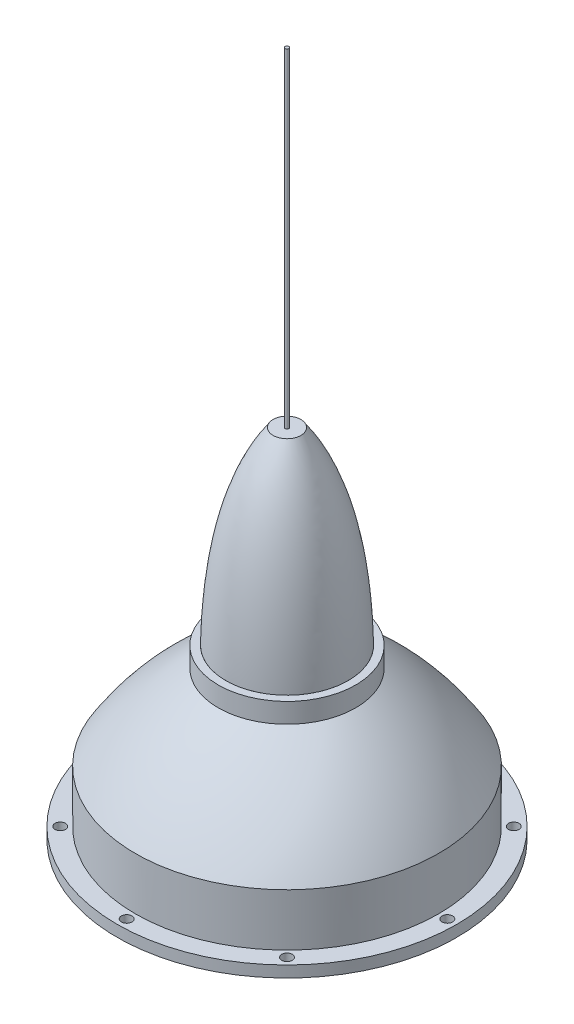
ISO-10303-21;
HEADER;
FILE_DESCRIPTION(('STEP AP214'),'2;1');
FILE_NAME('part.step','',(''),(''),'','','');
FILE_SCHEMA(('AUTOMOTIVE_DESIGN { 1 0 10303 214 1 1 1 1 }'));
ENDSEC;
DATA;
#1=APPLICATION_CONTEXT('core data for automotive mechanical design processes');
#2=APPLICATION_PROTOCOL_DEFINITION('international standard','automotive_design',2000,#1);
#3=PRODUCT_CONTEXT('',#1,'mechanical');
#4=PRODUCT('Part','Part','',(#3));
#5=PRODUCT_RELATED_PRODUCT_CATEGORY('part','',(#4));
#6=PRODUCT_DEFINITION_FORMATION('','',#4);
#7=PRODUCT_DEFINITION_CONTEXT('part definition',#1,'design');
#8=PRODUCT_DEFINITION('design','',#6,#7);
#9=PRODUCT_DEFINITION_SHAPE('','',#8);
#10=(LENGTH_UNIT() NAMED_UNIT(*) SI_UNIT(.MILLI.,.METRE.));
#11=(NAMED_UNIT(*) PLANE_ANGLE_UNIT() SI_UNIT($,.RADIAN.));
#12=(NAMED_UNIT(*) SI_UNIT($,.STERADIAN.) SOLID_ANGLE_UNIT());
#13=UNCERTAINTY_MEASURE_WITH_UNIT(LENGTH_MEASURE(1.E-05),#10,'distance_accuracy_value','');
#14=(GEOMETRIC_REPRESENTATION_CONTEXT(3) GLOBAL_UNCERTAINTY_ASSIGNED_CONTEXT((#13)) GLOBAL_UNIT_ASSIGNED_CONTEXT((#10,
#11,#12)) REPRESENTATION_CONTEXT('',''));
#15=CARTESIAN_POINT('',(0.,0.,0.));
#16=DIRECTION('',(0.,0.,1.));
#17=DIRECTION('',(1.,0.,0.));
#18=AXIS2_PLACEMENT_3D('',#15,#16,#17);
#19=CARTESIAN_POINT('',(3.67004780163327,86.5571134055351,0.));
#20=CARTESIAN_POINT('',(15.6355390227846,69.8890645806119,0.));
#21=CARTESIAN_POINT('',(16.2195562711198,36.557113405535,0.));
#22=B_SPLINE_CURVE_WITH_KNOTS('',2,(#19,#20,#21),.UNSPECIFIED.,.F.,.F.,(3,3),(0.,1.),.UNSPECIFIED.);
#23=CARTESIAN_POINT('',(0.,36.5571134055351,0.));
#24=DIRECTION('',(0.,-1.,0.));
#25=AXIS1_PLACEMENT('',#23,#24);
#26=SURFACE_OF_REVOLUTION('',#22,#25);
#27=CARTESIAN_POINT('',(0.,36.5571134055351,0.));
#28=DIRECTION('',(0.,-1.,0.));
#29=DIRECTION('',(0.,0.,-1.));
#30=AXIS2_PLACEMENT_3D('',#27,#28,#29);
#31=CIRCLE('',#30,16.2195562711198);
#32=CARTESIAN_POINT('',(0.,36.5571134055351,-16.2195562711198));
#33=VERTEX_POINT('',#32);
#34=EDGE_CURVE('E56',#33,#33,#31,.T.);
#35=ORIENTED_EDGE('',*,*,#34,.F.);
#36=EDGE_LOOP('',(#35));
#37=FACE_BOUND('',#36,.T.);
#38=CARTESIAN_POINT('',(0.,86.5571134055351,0.));
#39=DIRECTION('',(0.,-1.,0.));
#40=DIRECTION('',(0.,0.,-1.));
#41=AXIS2_PLACEMENT_3D('',#38,#39,#40);
#42=CIRCLE('',#41,3.67004780163327);
#43=CARTESIAN_POINT('',(0.,86.5571134055351,-3.67004780163327));
#44=VERTEX_POINT('',#43);
#45=EDGE_CURVE('E52',#44,#44,#42,.T.);
#46=ORIENTED_EDGE('',*,*,#45,.T.);
#47=EDGE_LOOP('',(#46));
#48=FACE_BOUND('',#47,.T.);
#49=ADVANCED_FACE('F45',(#37,#48),#26,.T.);
#50=CARTESIAN_POINT('',(0.,86.5571134055351,0.));
#51=DIRECTION('',(0.,-1.,0.));
#52=DIRECTION('',(0.,0.,-1.));
#53=AXIS2_PLACEMENT_3D('',#50,#51,#52);
#54=PLANE('',#53);
#55=CARTESIAN_POINT('',(0.,86.5571134055351,0.));
#56=DIRECTION('',(0.,-1.,0.));
#57=DIRECTION('',(0.,0.,-1.));
#58=AXIS2_PLACEMENT_3D('',#55,#56,#57);
#59=CIRCLE('',#58,0.5);
#60=CARTESIAN_POINT('',(0.,86.5571134055351,-0.5));
#61=VERTEX_POINT('',#60);
#62=EDGE_CURVE('E11',#61,#61,#59,.F.);
#63=ORIENTED_EDGE('',*,*,#62,.F.);
#64=EDGE_LOOP('',(#63));
#65=FACE_BOUND('',#64,.T.);
#66=ORIENTED_EDGE('',*,*,#45,.F.);
#67=EDGE_LOOP('',(#66));
#68=FACE_BOUND('',#67,.T.);
#69=ADVANCED_FACE('F83',(#65,#68),#54,.F.);
#70=CARTESIAN_POINT('',(0.,36.5571134055351,0.));
#71=DIRECTION('',(0.,1.,0.));
#72=DIRECTION('',(0.,0.,1.));
#73=AXIS2_PLACEMENT_3D('',#70,#71,#72);
#74=PLANE('',#73);
#75=ORIENTED_EDGE('',*,*,#34,.T.);
#76=EDGE_LOOP('',(#75));
#77=FACE_BOUND('',#76,.T.);
#78=ADVANCED_FACE('F76',(#77),#74,.F.);
#79=CARTESIAN_POINT('',(0.,173.757113405535,0.));
#80=DIRECTION('',(0.,-1.,0.));
#81=DIRECTION('',(0.,0.,-1.));
#82=AXIS2_PLACEMENT_3D('',#79,#80,#81);
#83=CYLINDRICAL_SURFACE('',#82,0.5);
#84=CARTESIAN_POINT('',(0.,173.757113405535,0.));
#85=DIRECTION('',(0.,1.,0.));
#86=DIRECTION('',(0.,0.,1.));
#87=AXIS2_PLACEMENT_3D('',#84,#85,#86);
#88=CIRCLE('',#87,0.5);
#89=CARTESIAN_POINT('',(0.,173.757113405535,0.5));
#90=VERTEX_POINT('',#89);
#91=EDGE_CURVE('E60',#90,#90,#88,.T.);
#92=ORIENTED_EDGE('',*,*,#91,.F.);
#93=EDGE_LOOP('',(#92));
#94=FACE_BOUND('',#93,.T.);
#95=ORIENTED_EDGE('',*,*,#62,.T.);
#96=EDGE_LOOP('',(#95));
#97=FACE_BOUND('',#96,.T.);
#98=ADVANCED_FACE('F74',(#94,#97),#83,.T.);
#99=CARTESIAN_POINT('',(0.,173.757113405535,0.));
#100=DIRECTION('',(0.,1.,0.));
#101=DIRECTION('',(0.,0.,1.));
#102=AXIS2_PLACEMENT_3D('',#99,#100,#101);
#103=PLANE('',#102);
#104=ORIENTED_EDGE('',*,*,#91,.T.);
#105=EDGE_LOOP('',(#104));
#106=FACE_BOUND('',#105,.T.);
#107=ADVANCED_FACE('F72',(#106),#103,.T.);
#108=CLOSED_SHELL('',(#49,#69,#78,#98,#107));
#109=MANIFOLD_SOLID_BREP('B2',#108);
#110=CARTESIAN_POINT('',(0.,10.,0.));
#111=DIRECTION('',(0.,-1.,0.));
#112=DIRECTION('',(0.,0.,-1.));
#113=AXIS2_PLACEMENT_3D('',#110,#111,#112);
#114=CYLINDRICAL_SURFACE('',#113,45.);
#115=CARTESIAN_POINT('',(0.,-8.,0.));
#116=DIRECTION('',(0.,-1.,0.));
#117=DIRECTION('',(0.,0.,-1.));
#118=AXIS2_PLACEMENT_3D('',#115,#116,#117);
#119=CIRCLE('',#118,45.);
#120=CARTESIAN_POINT('',(0.,-8.,-45.));
#121=VERTEX_POINT('',#120);
#122=EDGE_CURVE('E204',#121,#121,#119,.T.);
#123=ORIENTED_EDGE('',*,*,#122,.F.);
#124=EDGE_LOOP('',(#123));
#125=FACE_BOUND('',#124,.T.);
#126=CARTESIAN_POINT('',(0.,-4.99999999999999,0.));
#127=DIRECTION('',(0.,1.,0.));
#128=DIRECTION('',(0.,0.,1.));
#129=AXIS2_PLACEMENT_3D('',#126,#127,#128);
#130=CIRCLE('',#129,45.);
#131=CARTESIAN_POINT('',(0.,-4.99999999999999,45.));
#132=VERTEX_POINT('',#131);
#133=EDGE_CURVE('E198',#132,#132,#130,.T.);
#134=ORIENTED_EDGE('',*,*,#133,.F.);
#135=EDGE_LOOP('',(#134));
#136=FACE_BOUND('',#135,.T.);
#137=ADVANCED_FACE('F136',(#125,#136),#114,.T.);
#138=CARTESIAN_POINT('',(0.,6.,0.));
#139=DIRECTION('',(0.,-1.,0.));
#140=DIRECTION('',(0.,0.,-1.));
#141=AXIS2_PLACEMENT_3D('',#138,#139,#140);
#142=CYLINDRICAL_SURFACE('',#141,37.3593996728975);
#143=CARTESIAN_POINT('',(0.,-8.,0.));
#144=DIRECTION('',(0.,-1.,0.));
#145=DIRECTION('',(0.,0.,-1.));
#146=AXIS2_PLACEMENT_3D('',#143,#144,#145);
#147=CIRCLE('',#146,37.3593996728975);
#148=CARTESIAN_POINT('',(0.,-8.,-37.3593996728975));
#149=VERTEX_POINT('',#148);
#150=EDGE_CURVE('E201',#149,#149,#147,.T.);
#151=ORIENTED_EDGE('',*,*,#150,.T.);
#152=EDGE_LOOP('',(#151));
#153=FACE_BOUND('',#152,.T.);
#154=CARTESIAN_POINT('',(0.,6.,0.));
#155=DIRECTION('',(0.,-1.,0.));
#156=DIRECTION('',(0.,0.,-1.));
#157=AXIS2_PLACEMENT_3D('',#154,#155,#156);
#158=CIRCLE('',#157,37.3593996728975);
#159=CARTESIAN_POINT('',(0.,6.,-37.3593996728975));
#160=VERTEX_POINT('',#159);
#161=EDGE_CURVE('E213',#160,#160,#158,.T.);
#162=ORIENTED_EDGE('',*,*,#161,.F.);
#163=EDGE_LOOP('',(#162));
#164=FACE_BOUND('',#163,.T.);
#165=ADVANCED_FACE('F236',(#153,#164),#142,.F.);
#166=CARTESIAN_POINT('',(45.,0.,0.));
#167=CARTESIAN_POINT('',(38.3606255797979,14.1228774563605,0.));
#168=CARTESIAN_POINT('',(28.7671443364168,24.9752485917934,0.));
#169=CARTESIAN_POINT('',(16.2195562711198,32.5571134055351,0.));
#170=B_SPLINE_CURVE_WITH_KNOTS('',3,(#166,#167,#168,#169),.UNSPECIFIED.,.F.,.F.,(4,4),
(0.282784636754398,1.),.UNSPECIFIED.);
#171=CARTESIAN_POINT('',(0.,0.,0.));
#172=DIRECTION('',(0.,-1.,0.));
#173=AXIS1_PLACEMENT('',#171,#172);
#174=SURFACE_OF_REVOLUTION('',#170,#173);
#175=CARTESIAN_POINT('',(0.,31.304696185932,0.));
#176=DIRECTION('',(0.,-1.,0.));
#177=DIRECTION('',(0.,0.,-1.));
#178=AXIS2_PLACEMENT_3D('',#175,#176,#177);
#179=CIRCLE('',#178,18.2195562711198);
#180=CARTESIAN_POINT('',(0.,31.304696185932,-18.2195562711198));
#181=VERTEX_POINT('',#180);
#182=EDGE_CURVE('E44',#181,#181,#179,.F.);
#183=ORIENTED_EDGE('',*,*,#182,.F.);
#184=EDGE_LOOP('',(#183));
#185=FACE_BOUND('',#184,.T.);
#186=CARTESIAN_POINT('',(0.,8.85457499686986,0.));
#187=DIRECTION('',(0.,-1.,0.));
#188=DIRECTION('',(0.,0.,-1.));
#189=AXIS2_PLACEMENT_3D('',#186,#187,#188);
#190=CIRCLE('',#189,40.183847224859);
#191=CARTESIAN_POINT('',(0.,8.85457499686986,-40.183847224859));
#192=VERTEX_POINT('',#191);
#193=EDGE_CURVE('E154',#192,#192,#190,.F.);
#194=ORIENTED_EDGE('',*,*,#193,.T.);
#195=EDGE_LOOP('',(#194));
#196=FACE_BOUND('',#195,.T.);
#197=ADVANCED_FACE('F138',(#185,#196),#174,.F.);
#198=CARTESIAN_POINT('',(40.4481260719283,0.,0.));
#199=CARTESIAN_POINT('',(34.9985446803902,12.0780798448771,0.));
#200=CARTESIAN_POINT('',(26.9223547467816,21.8268668205378,0.));
#201=CARTESIAN_POINT('',(16.2195562711198,29.2463609269701,0.));
#202=B_SPLINE_CURVE_WITH_KNOTS('',3,(#198,#199,#200,#201),.UNSPECIFIED.,.F.,.F.,(4,4),(0.,
0.864735690541335),.UNSPECIFIED.);
#203=CARTESIAN_POINT('',(0.,0.,0.));
#204=DIRECTION('',(0.,-1.,0.));
#205=AXIS1_PLACEMENT('',#203,#204);
#206=SURFACE_OF_REVOLUTION('',#202,#205);
#207=CARTESIAN_POINT('',(0.,29.2463609269701,0.));
#208=DIRECTION('',(0.,-1.,0.));
#209=DIRECTION('',(0.,0.,-1.));
#210=AXIS2_PLACEMENT_3D('',#207,#208,#209);
#211=CIRCLE('',#210,16.2195562711198);
#212=CARTESIAN_POINT('',(0.,29.2463609269701,-16.2195562711198));
#213=VERTEX_POINT('',#212);
#214=EDGE_CURVE('E150',#213,#213,#211,.T.);
#215=ORIENTED_EDGE('',*,*,#214,.F.);
#216=EDGE_LOOP('',(#215));
#217=FACE_BOUND('',#216,.T.);
#218=CARTESIAN_POINT('',(0.,6.,0.));
#219=DIRECTION('',(0.,-1.,0.));
#220=DIRECTION('',(0.,0.,-1.));
#221=AXIS2_PLACEMENT_3D('',#218,#219,#220);
#222=CIRCLE('',#221,37.4174184704641);
#223=CARTESIAN_POINT('',(0.,6.,-37.4174184704641));
#224=VERTEX_POINT('',#223);
#225=EDGE_CURVE('E145',#224,#224,#222,.F.);
#226=ORIENTED_EDGE('',*,*,#225,.F.);
#227=EDGE_LOOP('',(#226));
#228=FACE_BOUND('',#227,.T.);
#229=ADVANCED_FACE('F223',(#217,#228),#206,.T.);
#230=CARTESIAN_POINT('',(0.,0.,0.));
#231=DIRECTION('',(0.,-1.,0.));
#232=DIRECTION('',(0.,0.,-1.));
#233=AXIS2_PLACEMENT_3D('',#230,#231,#232);
#234=CYLINDRICAL_SURFACE('',#233,16.2195562711198);
#235=ORIENTED_EDGE('',*,*,#214,.T.);
#236=EDGE_LOOP('',(#235));
#237=FACE_BOUND('',#236,.T.);
#238=CARTESIAN_POINT('',(0.,36.5571134055351,0.));
#239=DIRECTION('',(0.,1.,0.));
#240=DIRECTION('',(0.,0.,1.));
#241=AXIS2_PLACEMENT_3D('',#238,#239,#240);
#242=CIRCLE('',#241,16.2195562711198);
#243=CARTESIAN_POINT('',(0.,36.5571134055351,16.2195562711198));
#244=VERTEX_POINT('',#243);
#245=EDGE_CURVE('E207',#244,#244,#242,.T.);
#246=ORIENTED_EDGE('',*,*,#245,.T.);
#247=EDGE_LOOP('',(#246));
#248=FACE_BOUND('',#247,.T.);
#249=ADVANCED_FACE('F226',(#237,#248),#234,.F.);
#250=CARTESIAN_POINT('',(0.,6.,0.));
#251=DIRECTION('',(0.,-1.,0.));
#252=DIRECTION('',(0.,0.,-1.));
#253=AXIS2_PLACEMENT_3D('',#250,#251,#252);
#254=PLANE('',#253);
#255=ORIENTED_EDGE('',*,*,#161,.T.);
#256=EDGE_LOOP('',(#255));
#257=FACE_BOUND('',#256,.T.);
#258=ORIENTED_EDGE('',*,*,#225,.T.);
#259=EDGE_LOOP('',(#258));
#260=FACE_BOUND('',#259,.T.);
#261=ADVANCED_FACE('F230',(#257,#260),#254,.F.);
#262=CARTESIAN_POINT('',(0.,11.,0.));
#263=DIRECTION('',(0.,-1.,0.));
#264=DIRECTION('',(0.,0.,-1.));
#265=AXIS2_PLACEMENT_3D('',#262,#263,#264);
#266=CYLINDRICAL_SURFACE('',#265,40.183847224859);
#267=ORIENTED_EDGE('',*,*,#193,.F.);
#268=EDGE_LOOP('',(#267));
#269=FACE_BOUND('',#268,.T.);
#270=CARTESIAN_POINT('',(0.,-4.99999999999999,0.));
#271=DIRECTION('',(0.,1.,0.));
#272=DIRECTION('',(0.,0.,1.));
#273=AXIS2_PLACEMENT_3D('',#270,#271,#272);
#274=CIRCLE('',#273,40.183847224859);
#275=CARTESIAN_POINT('',(0.,-4.99999999999999,40.183847224859));
#276=VERTEX_POINT('',#275);
#277=EDGE_CURVE('E195',#276,#276,#274,.T.);
#278=ORIENTED_EDGE('',*,*,#277,.T.);
#279=EDGE_LOOP('',(#278));
#280=FACE_BOUND('',#279,.T.);
#281=ADVANCED_FACE('F234',(#269,#280),#266,.T.);
#282=CARTESIAN_POINT('',(0.,29.5571134055351,0.));
#283=DIRECTION('',(0.,1.,0.));
#284=DIRECTION('',(0.,0.,1.));
#285=AXIS2_PLACEMENT_3D('',#282,#283,#284);
#286=CYLINDRICAL_SURFACE('',#285,18.2195562711198);
#287=ORIENTED_EDGE('',*,*,#182,.T.);
#288=EDGE_LOOP('',(#287));
#289=FACE_BOUND('',#288,.T.);
#290=CARTESIAN_POINT('',(0.,36.5571134055351,0.));
#291=DIRECTION('',(0.,1.,0.));
#292=DIRECTION('',(0.,0.,1.));
#293=AXIS2_PLACEMENT_3D('',#290,#291,#292);
#294=CIRCLE('',#293,18.2195562711198);
#295=CARTESIAN_POINT('',(0.,36.5571134055351,18.2195562711198));
#296=VERTEX_POINT('',#295);
#297=EDGE_CURVE('E210',#296,#296,#294,.T.);
#298=ORIENTED_EDGE('',*,*,#297,.F.);
#299=EDGE_LOOP('',(#298));
#300=FACE_BOUND('',#299,.T.);
#301=ADVANCED_FACE('F242',(#289,#300),#286,.T.);
#302=CARTESIAN_POINT('',(0.,36.5571134055351,0.));
#303=DIRECTION('',(0.,1.,0.));
#304=DIRECTION('',(0.,0.,1.));
#305=AXIS2_PLACEMENT_3D('',#302,#303,#304);
#306=PLANE('',#305);
#307=ORIENTED_EDGE('',*,*,#297,.T.);
#308=EDGE_LOOP('',(#307));
#309=FACE_BOUND('',#308,.T.);
#310=ORIENTED_EDGE('',*,*,#245,.F.);
#311=EDGE_LOOP('',(#310));
#312=FACE_BOUND('',#311,.T.);
#313=ADVANCED_FACE('F249',(#309,#312),#306,.T.);
#314=CARTESIAN_POINT('',(0.,-8.,0.));
#315=DIRECTION('',(0.,-1.,0.));
#316=DIRECTION('',(0.,0.,-1.));
#317=AXIS2_PLACEMENT_3D('',#314,#315,#316);
#318=PLANE('',#317);
#319=CARTESIAN_POINT('',(42.5,-8.,4.8853195760192E-13));
#320=DIRECTION('',(0.,-1.,0.));
#321=DIRECTION('',(0.,0.,-1.));
#322=AXIS2_PLACEMENT_3D('',#319,#320,#321);
#323=CIRCLE('',#322,1.4);
#324=CARTESIAN_POINT('',(42.5,-8.,-1.39999999999951));
#325=VERTEX_POINT('',#324);
#326=EDGE_CURVE('E192',#325,#325,#323,.F.);
#327=ORIENTED_EDGE('',*,*,#326,.T.);
#328=EDGE_LOOP('',(#327));
#329=FACE_BOUND('',#328,.T.);
#330=CARTESIAN_POINT('',(30.0520382004279,-8.,30.0520382004287));
#331=DIRECTION('',(0.,-1.,0.));
#332=DIRECTION('',(0.,0.,-1.));
#333=AXIS2_PLACEMENT_3D('',#330,#331,#332);
#334=CIRCLE('',#333,1.4);
#335=CARTESIAN_POINT('',(30.0520382004279,-8.,28.6520382004287));
#336=VERTEX_POINT('',#335);
#337=EDGE_CURVE('E180',#336,#336,#334,.F.);
#338=ORIENTED_EDGE('',*,*,#337,.T.);
#339=EDGE_LOOP('',(#338));
#340=FACE_BOUND('',#339,.T.);
#341=CARTESIAN_POINT('',(0.,-8.,42.5));
#342=DIRECTION('',(0.,-1.,0.));
#343=DIRECTION('',(0.,0.,-1.));
#344=AXIS2_PLACEMENT_3D('',#341,#342,#343);
#345=CIRCLE('',#344,1.4);
#346=CARTESIAN_POINT('',(0.,-8.,41.1000000000001));
#347=VERTEX_POINT('',#346);
#348=EDGE_CURVE('E177',#347,#347,#345,.F.);
#349=ORIENTED_EDGE('',*,*,#348,.T.);
#350=EDGE_LOOP('',(#349));
#351=FACE_BOUND('',#350,.T.);
#352=CARTESIAN_POINT('',(-30.0520382004283,-8.,30.0520382004283));
#353=DIRECTION('',(0.,-1.,0.));
#354=DIRECTION('',(0.,0.,-1.));
#355=AXIS2_PLACEMENT_3D('',#352,#353,#354);
#356=CIRCLE('',#355,1.4);
#357=CARTESIAN_POINT('',(-30.0520382004283,-8.,28.6520382004283));
#358=VERTEX_POINT('',#357);
#359=EDGE_CURVE('E174',#358,#358,#356,.F.);
#360=ORIENTED_EDGE('',*,*,#359,.T.);
#361=EDGE_LOOP('',(#360));
#362=FACE_BOUND('',#361,.T.);
#363=CARTESIAN_POINT('',(-42.5,-8.,-1.05019870001413E-13));
#364=DIRECTION('',(0.,-1.,0.));
#365=DIRECTION('',(0.,0.,-1.));
#366=AXIS2_PLACEMENT_3D('',#363,#364,#365);
#367=CIRCLE('',#366,1.4);
#368=CARTESIAN_POINT('',(-42.5,-8.,-1.40000000000011));
#369=VERTEX_POINT('',#368);
#370=EDGE_CURVE('E170',#369,#369,#367,.F.);
#371=ORIENTED_EDGE('',*,*,#370,.T.);
#372=EDGE_LOOP('',(#371));
#373=FACE_BOUND('',#372,.T.);
#374=CARTESIAN_POINT('',(-30.0520382004281,-8.,-30.0520382004284));
#375=DIRECTION('',(0.,-1.,0.));
#376=DIRECTION('',(0.,0.,-1.));
#377=AXIS2_PLACEMENT_3D('',#374,#375,#376);
#378=CIRCLE('',#377,1.39999999999999);
#379=CARTESIAN_POINT('',(-30.0520382004281,-8.,-31.4520382004284));
#380=VERTEX_POINT('',#379);
#381=EDGE_CURVE('E166',#380,#380,#378,.F.);
#382=ORIENTED_EDGE('',*,*,#381,.T.);
#383=EDGE_LOOP('',(#382));
#384=FACE_BOUND('',#383,.T.);
#385=CARTESIAN_POINT('',(2.96775913801666E-13,-8.,-42.5));
#386=DIRECTION('',(0.,-1.,0.));
#387=DIRECTION('',(0.,0.,-1.));
#388=AXIS2_PLACEMENT_3D('',#385,#386,#387);
#389=CIRCLE('',#388,1.4);
#390=CARTESIAN_POINT('',(2.96775913801666E-13,-8.,-43.9));
#391=VERTEX_POINT('',#390);
#392=EDGE_CURVE('E162',#391,#391,#389,.F.);
#393=ORIENTED_EDGE('',*,*,#392,.T.);
#394=EDGE_LOOP('',(#393));
#395=FACE_BOUND('',#394,.T.);
#396=CARTESIAN_POINT('',(30.0520382004285,-8.,-30.052038200428));
#397=DIRECTION('',(0.,-1.,0.));
#398=DIRECTION('',(0.,0.,-1.));
#399=AXIS2_PLACEMENT_3D('',#396,#397,#398);
#400=CIRCLE('',#399,1.4);
#401=CARTESIAN_POINT('',(30.0520382004285,-8.,-31.452038200428));
#402=VERTEX_POINT('',#401);
#403=EDGE_CURVE('E158',#402,#402,#400,.F.);
#404=ORIENTED_EDGE('',*,*,#403,.T.);
#405=EDGE_LOOP('',(#404));
#406=FACE_BOUND('',#405,.T.);
#407=ORIENTED_EDGE('',*,*,#122,.T.);
#408=EDGE_LOOP('',(#407));
#409=FACE_BOUND('',#408,.T.);
#410=ORIENTED_EDGE('',*,*,#150,.F.);
#411=EDGE_LOOP('',(#410));
#412=FACE_BOUND('',#411,.T.);
#413=ADVANCED_FACE('F252',(#329,#340,#351,#362,#373,#384,#395,#406,#409,#412),#318,.T.);
#414=CARTESIAN_POINT('',(0.,-4.99999999999999,0.));
#415=DIRECTION('',(0.,1.,0.));
#416=DIRECTION('',(0.,0.,1.));
#417=AXIS2_PLACEMENT_3D('',#414,#415,#416);
#418=PLANE('',#417);
#419=CARTESIAN_POINT('',(42.5,-4.99999999999999,4.8853195760192E-13));
#420=DIRECTION('',(0.,1.,0.));
#421=DIRECTION('',(0.,0.,1.));
#422=AXIS2_PLACEMENT_3D('',#419,#420,#421);
#423=CIRCLE('',#422,1.4);
#424=CARTESIAN_POINT('',(42.5,-4.99999999999999,1.40000000000048));
#425=VERTEX_POINT('',#424);
#426=EDGE_CURVE('E141',#425,#425,#423,.F.);
#427=ORIENTED_EDGE('',*,*,#426,.T.);
#428=EDGE_LOOP('',(#427));
#429=FACE_BOUND('',#428,.T.);
#430=CARTESIAN_POINT('',(30.0520382004279,-4.99999999999999,30.0520382004287));
#431=DIRECTION('',(0.,1.,0.));
#432=DIRECTION('',(0.,0.,1.));
#433=AXIS2_PLACEMENT_3D('',#430,#431,#432);
#434=CIRCLE('',#433,1.4);
#435=CARTESIAN_POINT('',(30.0520382004279,-4.99999999999999,31.4520382004287));
#436=VERTEX_POINT('',#435);
#437=EDGE_CURVE('E178',#436,#436,#434,.F.);
#438=ORIENTED_EDGE('',*,*,#437,.T.);
#439=EDGE_LOOP('',(#438));
#440=FACE_BOUND('',#439,.T.);
#441=CARTESIAN_POINT('',(0.,-4.99999999999999,42.5));
#442=DIRECTION('',(0.,1.,0.));
#443=DIRECTION('',(0.,0.,1.));
#444=AXIS2_PLACEMENT_3D('',#441,#442,#443);
#445=CIRCLE('',#444,1.4);
#446=CARTESIAN_POINT('',(0.,-4.99999999999999,43.9));
#447=VERTEX_POINT('',#446);
#448=EDGE_CURVE('E175',#447,#447,#445,.F.);
#449=ORIENTED_EDGE('',*,*,#448,.T.);
#450=EDGE_LOOP('',(#449));
#451=FACE_BOUND('',#450,.T.);
#452=CARTESIAN_POINT('',(-30.0520382004283,-4.99999999999999,30.0520382004283));
#453=DIRECTION('',(0.,1.,0.));
#454=DIRECTION('',(0.,0.,1.));
#455=AXIS2_PLACEMENT_3D('',#452,#453,#454);
#456=CIRCLE('',#455,1.4);
#457=CARTESIAN_POINT('',(-30.0520382004283,-4.99999999999999,31.4520382004283));
#458=VERTEX_POINT('',#457);
#459=EDGE_CURVE('E171',#458,#458,#456,.F.);
#460=ORIENTED_EDGE('',*,*,#459,.T.);
#461=EDGE_LOOP('',(#460));
#462=FACE_BOUND('',#461,.T.);
#463=CARTESIAN_POINT('',(-42.5,-4.99999999999999,-1.05019870001413E-13));
#464=DIRECTION('',(0.,1.,0.));
#465=DIRECTION('',(0.,0.,1.));
#466=AXIS2_PLACEMENT_3D('',#463,#464,#465);
#467=CIRCLE('',#466,1.4);
#468=CARTESIAN_POINT('',(-42.5,-4.99999999999999,1.3999999999999));
#469=VERTEX_POINT('',#468);
#470=EDGE_CURVE('E167',#469,#469,#467,.F.);
#471=ORIENTED_EDGE('',*,*,#470,.T.);
#472=EDGE_LOOP('',(#471));
#473=FACE_BOUND('',#472,.T.);
#474=CARTESIAN_POINT('',(-30.0520382004281,-4.99999999999999,-30.0520382004284));
#475=DIRECTION('',(0.,1.,0.));
#476=DIRECTION('',(0.,0.,1.));
#477=AXIS2_PLACEMENT_3D('',#474,#475,#476);
#478=CIRCLE('',#477,1.39999999999999);
#479=CARTESIAN_POINT('',(-30.0520382004281,-4.99999999999999,-28.6520382004284));
#480=VERTEX_POINT('',#479);
#481=EDGE_CURVE('E163',#480,#480,#478,.F.);
#482=ORIENTED_EDGE('',*,*,#481,.T.);
#483=EDGE_LOOP('',(#482));
#484=FACE_BOUND('',#483,.T.);
#485=CARTESIAN_POINT('',(2.96775913801666E-13,-4.99999999999999,-42.5));
#486=DIRECTION('',(0.,1.,0.));
#487=DIRECTION('',(0.,0.,1.));
#488=AXIS2_PLACEMENT_3D('',#485,#486,#487);
#489=CIRCLE('',#488,1.4);
#490=CARTESIAN_POINT('',(2.96775913801666E-13,-4.99999999999999,-41.1));
#491=VERTEX_POINT('',#490);
#492=EDGE_CURVE('E159',#491,#491,#489,.F.);
#493=ORIENTED_EDGE('',*,*,#492,.T.);
#494=EDGE_LOOP('',(#493));
#495=FACE_BOUND('',#494,.T.);
#496=CARTESIAN_POINT('',(30.0520382004285,-4.99999999999999,-30.052038200428));
#497=DIRECTION('',(0.,1.,0.));
#498=DIRECTION('',(0.,0.,1.));
#499=AXIS2_PLACEMENT_3D('',#496,#497,#498);
#500=CIRCLE('',#499,1.4);
#501=CARTESIAN_POINT('',(30.0520382004285,-4.99999999999999,-28.652038200428));
#502=VERTEX_POINT('',#501);
#503=EDGE_CURVE('E155',#502,#502,#500,.F.);
#504=ORIENTED_EDGE('',*,*,#503,.T.);
#505=EDGE_LOOP('',(#504));
#506=FACE_BOUND('',#505,.T.);
#507=ORIENTED_EDGE('',*,*,#277,.F.);
#508=EDGE_LOOP('',(#507));
#509=FACE_BOUND('',#508,.T.);
#510=ORIENTED_EDGE('',*,*,#133,.T.);
#511=EDGE_LOOP('',(#510));
#512=FACE_BOUND('',#511,.T.);
#513=ADVANCED_FACE('F256',(#429,#440,#451,#462,#473,#484,#495,#506,#509,#512),#418,.T.);
#514=CARTESIAN_POINT('',(30.0520382004285,-9.99999999999999,-30.052038200428));
#515=DIRECTION('',(0.,1.,0.));
#516=DIRECTION('',(0.,0.,1.));
#517=AXIS2_PLACEMENT_3D('',#514,#515,#516);
#518=CYLINDRICAL_SURFACE('',#517,1.4);
#519=ORIENTED_EDGE('',*,*,#403,.F.);
#520=EDGE_LOOP('',(#519));
#521=FACE_BOUND('',#520,.T.);
#522=ORIENTED_EDGE('',*,*,#503,.F.);
#523=EDGE_LOOP('',(#522));
#524=FACE_BOUND('',#523,.T.);
#525=ADVANCED_FACE('F260',(#521,#524),#518,.F.);
#526=CARTESIAN_POINT('',(2.96775913801666E-13,-9.99999999999999,-42.5));
#527=DIRECTION('',(0.,1.,0.));
#528=DIRECTION('',(0.,0.,1.));
#529=AXIS2_PLACEMENT_3D('',#526,#527,#528);
#530=CYLINDRICAL_SURFACE('',#529,1.4);
#531=ORIENTED_EDGE('',*,*,#392,.F.);
#532=EDGE_LOOP('',(#531));
#533=FACE_BOUND('',#532,.T.);
#534=ORIENTED_EDGE('',*,*,#492,.F.);
#535=EDGE_LOOP('',(#534));
#536=FACE_BOUND('',#535,.T.);
#537=ADVANCED_FACE('F264',(#533,#536),#530,.F.);
#538=CARTESIAN_POINT('',(-30.0520382004281,-9.99999999999999,-30.0520382004284));
#539=DIRECTION('',(0.,1.,0.));
#540=DIRECTION('',(0.,0.,1.));
#541=AXIS2_PLACEMENT_3D('',#538,#539,#540);
#542=CYLINDRICAL_SURFACE('',#541,1.39999999999999);
#543=ORIENTED_EDGE('',*,*,#381,.F.);
#544=EDGE_LOOP('',(#543));
#545=FACE_BOUND('',#544,.T.);
#546=ORIENTED_EDGE('',*,*,#481,.F.);
#547=EDGE_LOOP('',(#546));
#548=FACE_BOUND('',#547,.T.);
#549=ADVANCED_FACE('F268',(#545,#548),#542,.F.);
#550=CARTESIAN_POINT('',(-42.5,-9.99999999999999,-1.05019870001413E-13));
#551=DIRECTION('',(0.,1.,0.));
#552=DIRECTION('',(0.,0.,1.));
#553=AXIS2_PLACEMENT_3D('',#550,#551,#552);
#554=CYLINDRICAL_SURFACE('',#553,1.4);
#555=ORIENTED_EDGE('',*,*,#370,.F.);
#556=EDGE_LOOP('',(#555));
#557=FACE_BOUND('',#556,.T.);
#558=ORIENTED_EDGE('',*,*,#470,.F.);
#559=EDGE_LOOP('',(#558));
#560=FACE_BOUND('',#559,.T.);
#561=ADVANCED_FACE('F272',(#557,#560),#554,.F.);
#562=CARTESIAN_POINT('',(-30.0520382004283,-9.99999999999999,30.0520382004283));
#563=DIRECTION('',(0.,1.,0.));
#564=DIRECTION('',(0.,0.,1.));
#565=AXIS2_PLACEMENT_3D('',#562,#563,#564);
#566=CYLINDRICAL_SURFACE('',#565,1.4);
#567=ORIENTED_EDGE('',*,*,#359,.F.);
#568=EDGE_LOOP('',(#567));
#569=FACE_BOUND('',#568,.T.);
#570=ORIENTED_EDGE('',*,*,#459,.F.);
#571=EDGE_LOOP('',(#570));
#572=FACE_BOUND('',#571,.T.);
#573=ADVANCED_FACE('F276',(#569,#572),#566,.F.);
#574=CARTESIAN_POINT('',(0.,-9.99999999999999,42.5));
#575=DIRECTION('',(0.,1.,0.));
#576=DIRECTION('',(0.,0.,1.));
#577=AXIS2_PLACEMENT_3D('',#574,#575,#576);
#578=CYLINDRICAL_SURFACE('',#577,1.4);
#579=ORIENTED_EDGE('',*,*,#348,.F.);
#580=EDGE_LOOP('',(#579));
#581=FACE_BOUND('',#580,.T.);
#582=ORIENTED_EDGE('',*,*,#448,.F.);
#583=EDGE_LOOP('',(#582));
#584=FACE_BOUND('',#583,.T.);
#585=ADVANCED_FACE('F280',(#581,#584),#578,.F.);
#586=CARTESIAN_POINT('',(30.0520382004279,-9.99999999999999,30.0520382004287));
#587=DIRECTION('',(0.,1.,0.));
#588=DIRECTION('',(0.,0.,1.));
#589=AXIS2_PLACEMENT_3D('',#586,#587,#588);
#590=CYLINDRICAL_SURFACE('',#589,1.4);
#591=ORIENTED_EDGE('',*,*,#337,.F.);
#592=EDGE_LOOP('',(#591));
#593=FACE_BOUND('',#592,.T.);
#594=ORIENTED_EDGE('',*,*,#437,.F.);
#595=EDGE_LOOP('',(#594));
#596=FACE_BOUND('',#595,.T.);
#597=ADVANCED_FACE('F284',(#593,#596),#590,.F.);
#598=CARTESIAN_POINT('',(42.5,-9.99999999999999,4.8853195760192E-13));
#599=DIRECTION('',(0.,1.,0.));
#600=DIRECTION('',(0.,0.,1.));
#601=AXIS2_PLACEMENT_3D('',#598,#599,#600);
#602=CYLINDRICAL_SURFACE('',#601,1.4);
#603=ORIENTED_EDGE('',*,*,#326,.F.);
#604=EDGE_LOOP('',(#603));
#605=FACE_BOUND('',#604,.T.);
#606=ORIENTED_EDGE('',*,*,#426,.F.);
#607=EDGE_LOOP('',(#606));
#608=FACE_BOUND('',#607,.T.);
#609=ADVANCED_FACE('F288',(#605,#608),#602,.F.);
#610=CLOSED_SHELL('',(#137,#165,#197,#229,#249,#261,#281,#301,#313,#413,#513,#525,#537,#549,
#561,#573,#585,#597,#609));
#611=MANIFOLD_SOLID_BREP('B6',#610);
#612=ADVANCED_BREP_SHAPE_REPRESENTATION('',(#18,#109,#611),#14);
#613=SHAPE_DEFINITION_REPRESENTATION(#9,#612);
ENDSEC;
END-ISO-10303-21;
